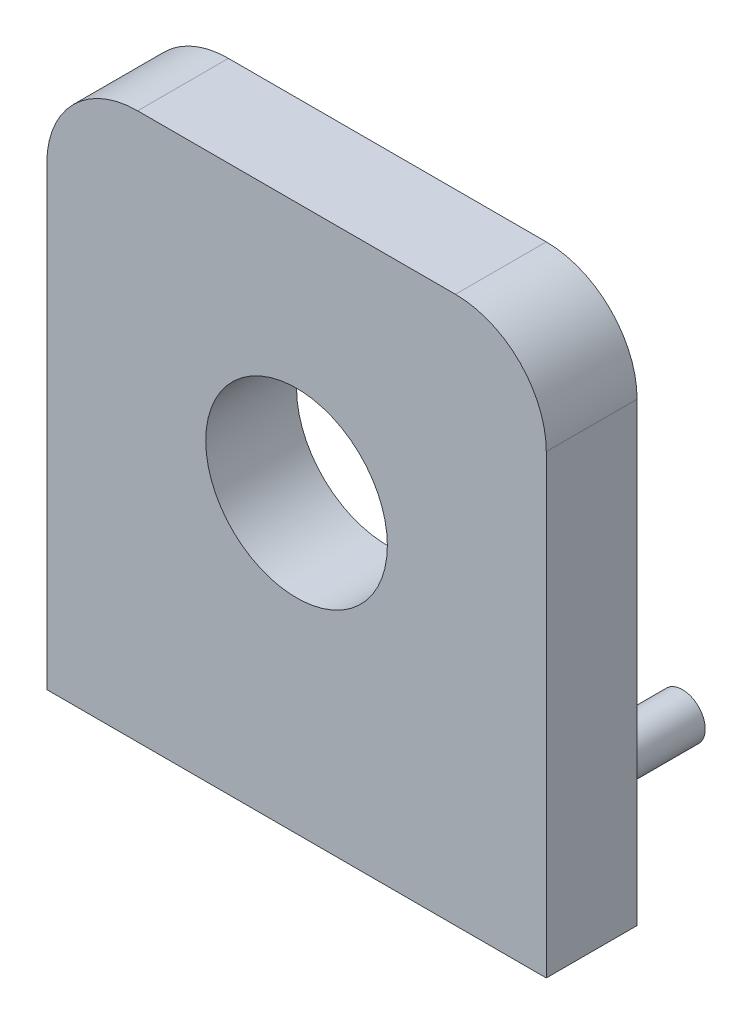
ISO-10303-21;
HEADER;
FILE_DESCRIPTION(('STEP AP214'),'2;1');
FILE_NAME('part.step','',(''),(''),'','','');
FILE_SCHEMA(('AUTOMOTIVE_DESIGN { 1 0 10303 214 1 1 1 1 }'));
ENDSEC;
DATA;
#1=APPLICATION_CONTEXT('core data for automotive mechanical design processes');
#2=APPLICATION_PROTOCOL_DEFINITION('international standard','automotive_design',2000,#1);
#3=PRODUCT_CONTEXT('',#1,'mechanical');
#4=PRODUCT('Part','Part','',(#3));
#5=PRODUCT_RELATED_PRODUCT_CATEGORY('part','',(#4));
#6=PRODUCT_DEFINITION_FORMATION('','',#4);
#7=PRODUCT_DEFINITION_CONTEXT('part definition',#1,'design');
#8=PRODUCT_DEFINITION('design','',#6,#7);
#9=PRODUCT_DEFINITION_SHAPE('','',#8);
#10=(LENGTH_UNIT() NAMED_UNIT(*) SI_UNIT(.MILLI.,.METRE.));
#11=(NAMED_UNIT(*) PLANE_ANGLE_UNIT() SI_UNIT($,.RADIAN.));
#12=(NAMED_UNIT(*) SI_UNIT($,.STERADIAN.) SOLID_ANGLE_UNIT());
#13=UNCERTAINTY_MEASURE_WITH_UNIT(LENGTH_MEASURE(1.E-05),#10,'distance_accuracy_value','');
#14=(GEOMETRIC_REPRESENTATION_CONTEXT(3) GLOBAL_UNCERTAINTY_ASSIGNED_CONTEXT((#13)) GLOBAL_UNIT_ASSIGNED_CONTEXT((#10,
#11,#12)) REPRESENTATION_CONTEXT('',''));
#15=CARTESIAN_POINT('',(0.,0.,0.));
#16=DIRECTION('',(0.,0.,1.));
#17=DIRECTION('',(1.,0.,0.));
#18=AXIS2_PLACEMENT_3D('',#15,#16,#17);
#19=CARTESIAN_POINT('',(5.5,5.54,2.));
#20=DIRECTION('',(-1.,0.,0.));
#21=DIRECTION('',(0.,0.,1.));
#22=AXIS2_PLACEMENT_3D('',#19,#20,#21);
#23=PLANE('',#22);
#24=DIRECTION('',(0.,1.,0.));
#25=VECTOR('',#24,1.);
#26=CARTESIAN_POINT('',(5.5,5.54,0.));
#27=LINE('',#26,#25);
#28=CARTESIAN_POINT('',(5.5,-6.5,0.));
#29=VERTEX_POINT('',#28);
#30=CARTESIAN_POINT('',(5.5,3.54,0.));
#31=VERTEX_POINT('',#30);
#32=EDGE_CURVE('E126',#29,#31,#27,.T.);
#33=ORIENTED_EDGE('',*,*,#32,.T.);
#34=DIRECTION('',(0.,0.,-1.));
#35=VECTOR('',#34,1.);
#36=CARTESIAN_POINT('',(5.5,3.54,2.));
#37=LINE('',#36,#35);
#38=CARTESIAN_POINT('',(5.5,3.54,2.));
#39=VERTEX_POINT('',#38);
#40=EDGE_CURVE('E153',#31,#39,#37,.F.);
#41=ORIENTED_EDGE('',*,*,#40,.T.);
#42=DIRECTION('',(0.,1.,0.));
#43=VECTOR('',#42,1.);
#44=CARTESIAN_POINT('',(5.5,5.54,2.));
#45=LINE('',#44,#43);
#46=CARTESIAN_POINT('',(5.5,-6.5,2.));
#47=VERTEX_POINT('',#46);
#48=EDGE_CURVE('E136',#47,#39,#45,.T.);
#49=ORIENTED_EDGE('',*,*,#48,.F.);
#50=DIRECTION('',(0.,0.,-1.));
#51=VECTOR('',#50,1.);
#52=CARTESIAN_POINT('',(5.5,-6.5,2.));
#53=LINE('',#52,#51);
#54=EDGE_CURVE('E117',#47,#29,#53,.T.);
#55=ORIENTED_EDGE('',*,*,#54,.T.);
#56=EDGE_LOOP('',(#33,#41,#49,#55));
#57=FACE_BOUND('',#56,.T.);
#58=ADVANCED_FACE('F34',(#57),#23,.F.);
#59=CARTESIAN_POINT('',(-5.5,5.54,2.));
#60=DIRECTION('',(0.,-1.,0.));
#61=DIRECTION('',(0.,0.,-1.));
#62=AXIS2_PLACEMENT_3D('',#59,#60,#61);
#63=PLANE('',#62);
#64=DIRECTION('',(-1.,0.,0.));
#65=VECTOR('',#64,1.);
#66=CARTESIAN_POINT('',(-5.5,5.54,0.));
#67=LINE('',#66,#65);
#68=CARTESIAN_POINT('',(3.5,5.54,0.));
#69=VERTEX_POINT('',#68);
#70=CARTESIAN_POINT('',(-3.5,5.54,0.));
#71=VERTEX_POINT('',#70);
#72=EDGE_CURVE('E129',#69,#71,#67,.T.);
#73=ORIENTED_EDGE('',*,*,#72,.T.);
#74=DIRECTION('',(0.,0.,-1.));
#75=VECTOR('',#74,1.);
#76=CARTESIAN_POINT('',(-3.5,5.54,2.));
#77=LINE('',#76,#75);
#78=CARTESIAN_POINT('',(-3.5,5.54,2.));
#79=VERTEX_POINT('',#78);
#80=EDGE_CURVE('E148',#71,#79,#77,.F.);
#81=ORIENTED_EDGE('',*,*,#80,.T.);
#82=DIRECTION('',(-1.,0.,0.));
#83=VECTOR('',#82,1.);
#84=CARTESIAN_POINT('',(-5.5,5.54,2.));
#85=LINE('',#84,#83);
#86=CARTESIAN_POINT('',(3.5,5.54,2.));
#87=VERTEX_POINT('',#86);
#88=EDGE_CURVE('E106',#87,#79,#85,.T.);
#89=ORIENTED_EDGE('',*,*,#88,.F.);
#90=DIRECTION('',(0.,0.,-1.));
#91=VECTOR('',#90,1.);
#92=CARTESIAN_POINT('',(3.5,5.54,2.));
#93=LINE('',#92,#91);
#94=EDGE_CURVE('E145',#87,#69,#93,.T.);
#95=ORIENTED_EDGE('',*,*,#94,.T.);
#96=EDGE_LOOP('',(#73,#81,#89,#95));
#97=FACE_BOUND('',#96,.T.);
#98=ADVANCED_FACE('F240',(#97),#63,.F.);
#99=CARTESIAN_POINT('',(-5.5,-6.5,2.));
#100=DIRECTION('',(1.,0.,0.));
#101=DIRECTION('',(0.,0.,-1.));
#102=AXIS2_PLACEMENT_3D('',#99,#100,#101);
#103=PLANE('',#102);
#104=DIRECTION('',(0.,-1.,0.));
#105=VECTOR('',#104,1.);
#106=CARTESIAN_POINT('',(-5.5,-6.5,2.));
#107=LINE('',#106,#105);
#108=CARTESIAN_POINT('',(-5.5,3.54,2.));
#109=VERTEX_POINT('',#108);
#110=CARTESIAN_POINT('',(-5.5,-6.5,2.));
#111=VERTEX_POINT('',#110);
#112=EDGE_CURVE('E93',#109,#111,#107,.T.);
#113=ORIENTED_EDGE('',*,*,#112,.F.);
#114=DIRECTION('',(0.,0.,-1.));
#115=VECTOR('',#114,1.);
#116=CARTESIAN_POINT('',(-5.5,3.54,2.));
#117=LINE('',#116,#115);
#118=CARTESIAN_POINT('',(-5.5,3.54,0.));
#119=VERTEX_POINT('',#118);
#120=EDGE_CURVE('E116',#109,#119,#117,.T.);
#121=ORIENTED_EDGE('',*,*,#120,.T.);
#122=DIRECTION('',(0.,-1.,0.));
#123=VECTOR('',#122,1.);
#124=CARTESIAN_POINT('',(-5.5,-6.5,0.));
#125=LINE('',#124,#123);
#126=CARTESIAN_POINT('',(-5.5,-6.5,0.));
#127=VERTEX_POINT('',#126);
#128=EDGE_CURVE('E112',#119,#127,#125,.T.);
#129=ORIENTED_EDGE('',*,*,#128,.T.);
#130=DIRECTION('',(0.,0.,-1.));
#131=VECTOR('',#130,1.);
#132=CARTESIAN_POINT('',(-5.5,-6.5,2.));
#133=LINE('',#132,#131);
#134=EDGE_CURVE('E109',#111,#127,#133,.T.);
#135=ORIENTED_EDGE('',*,*,#134,.F.);
#136=EDGE_LOOP('',(#113,#121,#129,#135));
#137=FACE_BOUND('',#136,.T.);
#138=ADVANCED_FACE('F110',(#137),#103,.F.);
#139=CARTESIAN_POINT('',(5.5,-6.5,2.));
#140=DIRECTION('',(0.,1.,0.));
#141=DIRECTION('',(0.,0.,1.));
#142=AXIS2_PLACEMENT_3D('',#139,#140,#141);
#143=PLANE('',#142);
#144=DIRECTION('',(1.,0.,0.));
#145=VECTOR('',#144,1.);
#146=CARTESIAN_POINT('',(5.5,-6.5,0.));
#147=LINE('',#146,#145);
#148=CARTESIAN_POINT('',(-2.5,-6.5,0.));
#149=VERTEX_POINT('',#148);
#150=EDGE_CURVE('E135',#127,#149,#147,.T.);
#151=ORIENTED_EDGE('',*,*,#150,.T.);
#152=CARTESIAN_POINT('',(0.,-6.5,0.));
#153=VERTEX_POINT('',#152);
#154=EDGE_CURVE('E137',#149,#153,#147,.T.);
#155=ORIENTED_EDGE('',*,*,#154,.T.);
#156=CARTESIAN_POINT('',(2.5,-6.5,0.));
#157=VERTEX_POINT('',#156);
#158=EDGE_CURVE('E138',#153,#157,#147,.T.);
#159=ORIENTED_EDGE('',*,*,#158,.T.);
#160=EDGE_CURVE('E134',#157,#29,#147,.T.);
#161=ORIENTED_EDGE('',*,*,#160,.T.);
#162=ORIENTED_EDGE('',*,*,#54,.F.);
#163=DIRECTION('',(1.,0.,0.));
#164=VECTOR('',#163,1.);
#165=CARTESIAN_POINT('',(5.5,-6.5,2.));
#166=LINE('',#165,#164);
#167=EDGE_CURVE('E99',#111,#47,#166,.T.);
#168=ORIENTED_EDGE('',*,*,#167,.F.);
#169=ORIENTED_EDGE('',*,*,#134,.T.);
#170=EDGE_LOOP('',(#151,#155,#159,#161,#162,#168,#169));
#171=FACE_BOUND('',#170,.T.);
#172=ADVANCED_FACE('F119',(#171),#143,.F.);
#173=CARTESIAN_POINT('',(0.,0.,2.));
#174=DIRECTION('',(0.,0.,-1.));
#175=DIRECTION('',(-1.,0.,0.));
#176=AXIS2_PLACEMENT_3D('',#173,#174,#175);
#177=PLANE('',#176);
#178=CARTESIAN_POINT('',(0.,0.,2.));
#179=DIRECTION('',(0.,0.,1.));
#180=DIRECTION('',(1.,0.,0.));
#181=AXIS2_PLACEMENT_3D('',#178,#179,#180);
#182=CIRCLE('',#181,2.);
#183=CARTESIAN_POINT('',(2.,0.,2.));
#184=VERTEX_POINT('',#183);
#185=EDGE_CURVE('E130',#184,#184,#182,.T.);
#186=ORIENTED_EDGE('',*,*,#185,.F.);
#187=EDGE_LOOP('',(#186));
#188=FACE_BOUND('',#187,.T.);
#189=ORIENTED_EDGE('',*,*,#88,.T.);
#190=CARTESIAN_POINT('',(-3.5,3.54,2.));
#191=DIRECTION('',(0.,0.,-1.));
#192=DIRECTION('',(-1.,0.,0.));
#193=AXIS2_PLACEMENT_3D('',#190,#191,#192);
#194=CIRCLE('',#193,2.);
#195=EDGE_CURVE('E102',#79,#109,#194,.F.);
#196=ORIENTED_EDGE('',*,*,#195,.T.);
#197=ORIENTED_EDGE('',*,*,#112,.T.);
#198=ORIENTED_EDGE('',*,*,#167,.T.);
#199=ORIENTED_EDGE('',*,*,#48,.T.);
#200=CARTESIAN_POINT('',(3.5,3.54,2.));
#201=DIRECTION('',(0.,0.,-1.));
#202=DIRECTION('',(-1.,0.,0.));
#203=AXIS2_PLACEMENT_3D('',#200,#201,#202);
#204=CIRCLE('',#203,2.);
#205=EDGE_CURVE('E150',#39,#87,#204,.F.);
#206=ORIENTED_EDGE('',*,*,#205,.T.);
#207=EDGE_LOOP('',(#189,#196,#197,#198,#199,#206));
#208=FACE_BOUND('',#207,.T.);
#209=ADVANCED_FACE('F96',(#188,#208),#177,.F.);
#210=CARTESIAN_POINT('',(0.,0.,0.));
#211=DIRECTION('',(0.,0.,-1.));
#212=DIRECTION('',(-1.,0.,0.));
#213=AXIS2_PLACEMENT_3D('',#210,#211,#212);
#214=PLANE('',#213);
#215=CARTESIAN_POINT('',(-2.5,-4.493,0.));
#216=DIRECTION('',(0.,0.,-1.));
#217=DIRECTION('',(-1.,0.,0.));
#218=AXIS2_PLACEMENT_3D('',#215,#216,#217);
#219=CIRCLE('',#218,0.5);
#220=CARTESIAN_POINT('',(-3.,-4.493,0.));
#221=VERTEX_POINT('',#220);
#222=EDGE_CURVE('E11',#221,#221,#219,.T.);
#223=ORIENTED_EDGE('',*,*,#222,.F.);
#224=EDGE_LOOP('',(#223));
#225=FACE_BOUND('',#224,.T.);
#226=CARTESIAN_POINT('',(2.5,-4.493,0.));
#227=DIRECTION('',(0.,0.,-1.));
#228=DIRECTION('',(-1.,0.,0.));
#229=AXIS2_PLACEMENT_3D('',#226,#227,#228);
#230=CIRCLE('',#229,0.5);
#231=CARTESIAN_POINT('',(2.,-4.493,0.));
#232=VERTEX_POINT('',#231);
#233=EDGE_CURVE('E42',#232,#232,#230,.T.);
#234=ORIENTED_EDGE('',*,*,#233,.F.);
#235=EDGE_LOOP('',(#234));
#236=FACE_BOUND('',#235,.T.);
#237=CARTESIAN_POINT('',(-2.5,3.,0.));
#238=DIRECTION('',(0.,0.,-1.));
#239=DIRECTION('',(-1.,0.,0.));
#240=AXIS2_PLACEMENT_3D('',#237,#238,#239);
#241=CIRCLE('',#240,0.5);
#242=CARTESIAN_POINT('',(-3.,3.,0.));
#243=VERTEX_POINT('',#242);
#244=EDGE_CURVE('E158',#243,#243,#241,.T.);
#245=ORIENTED_EDGE('',*,*,#244,.F.);
#246=EDGE_LOOP('',(#245));
#247=FACE_BOUND('',#246,.T.);
#248=CARTESIAN_POINT('',(2.5,3.,0.));
#249=DIRECTION('',(0.,0.,-1.));
#250=DIRECTION('',(-1.,0.,0.));
#251=AXIS2_PLACEMENT_3D('',#248,#249,#250);
#252=CIRCLE('',#251,0.5);
#253=CARTESIAN_POINT('',(2.,3.,0.));
#254=VERTEX_POINT('',#253);
#255=EDGE_CURVE('E155',#254,#254,#252,.T.);
#256=ORIENTED_EDGE('',*,*,#255,.F.);
#257=EDGE_LOOP('',(#256));
#258=FACE_BOUND('',#257,.T.);
#259=CARTESIAN_POINT('',(0.,0.,0.));
#260=DIRECTION('',(0.,0.,1.));
#261=DIRECTION('',(1.,0.,0.));
#262=AXIS2_PLACEMENT_3D('',#259,#260,#261);
#263=CIRCLE('',#262,2.);
#264=CARTESIAN_POINT('',(2.,0.,0.));
#265=VERTEX_POINT('',#264);
#266=EDGE_CURVE('E178',#265,#265,#263,.T.);
#267=ORIENTED_EDGE('',*,*,#266,.T.);
#268=EDGE_LOOP('',(#267));
#269=FACE_BOUND('',#268,.T.);
#270=ORIENTED_EDGE('',*,*,#160,.F.);
#271=CARTESIAN_POINT('',(2.5,-6.,0.));
#272=DIRECTION('',(0.,0.,-1.));
#273=DIRECTION('',(-1.,0.,0.));
#274=AXIS2_PLACEMENT_3D('',#271,#272,#273);
#275=CIRCLE('',#274,0.5);
#276=EDGE_CURVE('E47',#157,#157,#275,.T.);
#277=ORIENTED_EDGE('',*,*,#276,.F.);
#278=ORIENTED_EDGE('',*,*,#158,.F.);
#279=CARTESIAN_POINT('',(0.,-6.,0.));
#280=DIRECTION('',(0.,0.,-1.));
#281=DIRECTION('',(-1.,0.,0.));
#282=AXIS2_PLACEMENT_3D('',#279,#280,#281);
#283=CIRCLE('',#282,0.5);
#284=EDGE_CURVE('E186',#153,#153,#283,.T.);
#285=ORIENTED_EDGE('',*,*,#284,.F.);
#286=ORIENTED_EDGE('',*,*,#154,.F.);
#287=CARTESIAN_POINT('',(-2.5,-6.,0.));
#288=DIRECTION('',(0.,0.,-1.));
#289=DIRECTION('',(-1.,0.,0.));
#290=AXIS2_PLACEMENT_3D('',#287,#288,#289);
#291=CIRCLE('',#290,0.5);
#292=EDGE_CURVE('E52',#149,#149,#291,.T.);
#293=ORIENTED_EDGE('',*,*,#292,.F.);
#294=ORIENTED_EDGE('',*,*,#150,.F.);
#295=ORIENTED_EDGE('',*,*,#128,.F.);
#296=CARTESIAN_POINT('',(-3.5,3.54,0.));
#297=DIRECTION('',(0.,0.,-1.));
#298=DIRECTION('',(-1.,0.,0.));
#299=AXIS2_PLACEMENT_3D('',#296,#297,#298);
#300=CIRCLE('',#299,2.);
#301=EDGE_CURVE('E143',#119,#71,#300,.T.);
#302=ORIENTED_EDGE('',*,*,#301,.T.);
#303=ORIENTED_EDGE('',*,*,#72,.F.);
#304=CARTESIAN_POINT('',(3.5,3.54,0.));
#305=DIRECTION('',(0.,0.,-1.));
#306=DIRECTION('',(-1.,0.,0.));
#307=AXIS2_PLACEMENT_3D('',#304,#305,#306);
#308=CIRCLE('',#307,2.);
#309=EDGE_CURVE('E141',#69,#31,#308,.T.);
#310=ORIENTED_EDGE('',*,*,#309,.T.);
#311=ORIENTED_EDGE('',*,*,#32,.F.);
#312=EDGE_LOOP('',(#270,#277,#278,#285,#286,#293,#294,#295,#302,#303,#310,#311));
#313=FACE_BOUND('',#312,.T.);
#314=ADVANCED_FACE('F165',(#225,#236,#247,#258,#269,#313),#214,.T.);
#315=CARTESIAN_POINT('',(-3.5,3.54,2.));
#316=DIRECTION('',(0.,0.,-1.));
#317=DIRECTION('',(-1.,0.,0.));
#318=AXIS2_PLACEMENT_3D('',#315,#316,#317);
#319=CYLINDRICAL_SURFACE('',#318,2.);
#320=ORIENTED_EDGE('',*,*,#195,.F.);
#321=ORIENTED_EDGE('',*,*,#80,.F.);
#322=ORIENTED_EDGE('',*,*,#301,.F.);
#323=ORIENTED_EDGE('',*,*,#120,.F.);
#324=EDGE_LOOP('',(#320,#321,#322,#323));
#325=FACE_BOUND('',#324,.T.);
#326=ADVANCED_FACE('F168',(#325),#319,.T.);
#327=CARTESIAN_POINT('',(3.5,3.54,2.));
#328=DIRECTION('',(0.,0.,-1.));
#329=DIRECTION('',(-1.,0.,0.));
#330=AXIS2_PLACEMENT_3D('',#327,#328,#329);
#331=CYLINDRICAL_SURFACE('',#330,2.);
#332=ORIENTED_EDGE('',*,*,#205,.F.);
#333=ORIENTED_EDGE('',*,*,#40,.F.);
#334=ORIENTED_EDGE('',*,*,#309,.F.);
#335=ORIENTED_EDGE('',*,*,#94,.F.);
#336=EDGE_LOOP('',(#332,#333,#334,#335));
#337=FACE_BOUND('',#336,.T.);
#338=ADVANCED_FACE('F36',(#337),#331,.T.);
#339=CARTESIAN_POINT('',(0.,0.,2.));
#340=DIRECTION('',(0.,0.,-1.));
#341=DIRECTION('',(-1.,0.,0.));
#342=AXIS2_PLACEMENT_3D('',#339,#340,#341);
#343=CYLINDRICAL_SURFACE('',#342,2.);
#344=ORIENTED_EDGE('',*,*,#185,.T.);
#345=EDGE_LOOP('',(#344));
#346=FACE_BOUND('',#345,.T.);
#347=ORIENTED_EDGE('',*,*,#266,.F.);
#348=EDGE_LOOP('',(#347));
#349=FACE_BOUND('',#348,.T.);
#350=ADVANCED_FACE('F252',(#346,#349),#343,.F.);
#351=CARTESIAN_POINT('',(2.5,3.,-0.5));
#352=DIRECTION('',(0.,0.,1.));
#353=DIRECTION('',(1.,0.,0.));
#354=AXIS2_PLACEMENT_3D('',#351,#352,#353);
#355=CYLINDRICAL_SURFACE('',#354,0.5);
#356=CARTESIAN_POINT('',(2.5,3.,-0.5));
#357=DIRECTION('',(0.,0.,1.));
#358=DIRECTION('',(1.,0.,0.));
#359=AXIS2_PLACEMENT_3D('',#356,#357,#358);
#360=CIRCLE('',#359,0.5);
#361=CARTESIAN_POINT('',(3.,3.,-0.5));
#362=VERTEX_POINT('',#361);
#363=EDGE_CURVE('E206',#362,#362,#360,.T.);
#364=ORIENTED_EDGE('',*,*,#363,.T.);
#365=EDGE_LOOP('',(#364));
#366=FACE_BOUND('',#365,.T.);
#367=ORIENTED_EDGE('',*,*,#255,.T.);
#368=EDGE_LOOP('',(#367));
#369=FACE_BOUND('',#368,.T.);
#370=ADVANCED_FACE('F257',(#366,#369),#355,.T.);
#371=CARTESIAN_POINT('',(2.5,3.,-0.5));
#372=DIRECTION('',(0.,0.,1.));
#373=DIRECTION('',(1.,0.,0.));
#374=AXIS2_PLACEMENT_3D('',#371,#372,#373);
#375=PLANE('',#374);
#376=ORIENTED_EDGE('',*,*,#363,.F.);
#377=EDGE_LOOP('',(#376));
#378=FACE_BOUND('',#377,.T.);
#379=ADVANCED_FACE('F264',(#378),#375,.F.);
#380=CARTESIAN_POINT('',(-2.5,3.,-0.5));
#381=DIRECTION('',(0.,0.,1.));
#382=DIRECTION('',(1.,0.,0.));
#383=AXIS2_PLACEMENT_3D('',#380,#381,#382);
#384=CYLINDRICAL_SURFACE('',#383,0.5);
#385=CARTESIAN_POINT('',(-2.5,3.,-0.5));
#386=DIRECTION('',(0.,0.,1.));
#387=DIRECTION('',(1.,0.,0.));
#388=AXIS2_PLACEMENT_3D('',#385,#386,#387);
#389=CIRCLE('',#388,0.5);
#390=CARTESIAN_POINT('',(-2.,3.,-0.5));
#391=VERTEX_POINT('',#390);
#392=EDGE_CURVE('E203',#391,#391,#389,.T.);
#393=ORIENTED_EDGE('',*,*,#392,.T.);
#394=EDGE_LOOP('',(#393));
#395=FACE_BOUND('',#394,.T.);
#396=ORIENTED_EDGE('',*,*,#244,.T.);
#397=EDGE_LOOP('',(#396));
#398=FACE_BOUND('',#397,.T.);
#399=ADVANCED_FACE('F363',(#395,#398),#384,.T.);
#400=CARTESIAN_POINT('',(-2.5,3.,-0.5));
#401=DIRECTION('',(0.,0.,1.));
#402=DIRECTION('',(1.,0.,0.));
#403=AXIS2_PLACEMENT_3D('',#400,#401,#402);
#404=PLANE('',#403);
#405=ORIENTED_EDGE('',*,*,#392,.F.);
#406=EDGE_LOOP('',(#405));
#407=FACE_BOUND('',#406,.T.);
#408=ADVANCED_FACE('F359',(#407),#404,.F.);
#409=CARTESIAN_POINT('',(2.5,-4.493,-0.5));
#410=DIRECTION('',(0.,0.,1.));
#411=DIRECTION('',(1.,0.,0.));
#412=AXIS2_PLACEMENT_3D('',#409,#410,#411);
#413=CYLINDRICAL_SURFACE('',#412,0.5);
#414=CARTESIAN_POINT('',(2.5,-4.493,-0.5));
#415=DIRECTION('',(0.,0.,1.));
#416=DIRECTION('',(1.,0.,0.));
#417=AXIS2_PLACEMENT_3D('',#414,#415,#416);
#418=CIRCLE('',#417,0.5);
#419=CARTESIAN_POINT('',(3.,-4.493,-0.5));
#420=VERTEX_POINT('',#419);
#421=EDGE_CURVE('E200',#420,#420,#418,.T.);
#422=ORIENTED_EDGE('',*,*,#421,.T.);
#423=EDGE_LOOP('',(#422));
#424=FACE_BOUND('',#423,.T.);
#425=ORIENTED_EDGE('',*,*,#233,.T.);
#426=EDGE_LOOP('',(#425));
#427=FACE_BOUND('',#426,.T.);
#428=ADVANCED_FACE('F163',(#424,#427),#413,.T.);
#429=CARTESIAN_POINT('',(2.5,-4.493,-0.5));
#430=DIRECTION('',(0.,0.,1.));
#431=DIRECTION('',(1.,0.,0.));
#432=AXIS2_PLACEMENT_3D('',#429,#430,#431);
#433=PLANE('',#432);
#434=ORIENTED_EDGE('',*,*,#421,.F.);
#435=EDGE_LOOP('',(#434));
#436=FACE_BOUND('',#435,.T.);
#437=ADVANCED_FACE('F352',(#436),#433,.F.);
#438=CARTESIAN_POINT('',(-2.5,-4.493,-0.5));
#439=DIRECTION('',(0.,0.,1.));
#440=DIRECTION('',(1.,0.,0.));
#441=AXIS2_PLACEMENT_3D('',#438,#439,#440);
#442=CYLINDRICAL_SURFACE('',#441,0.5);
#443=CARTESIAN_POINT('',(-2.5,-4.493,-0.5));
#444=DIRECTION('',(0.,0.,1.));
#445=DIRECTION('',(1.,0.,0.));
#446=AXIS2_PLACEMENT_3D('',#443,#444,#445);
#447=CIRCLE('',#446,0.5);
#448=CARTESIAN_POINT('',(-2.,-4.493,-0.5));
#449=VERTEX_POINT('',#448);
#450=EDGE_CURVE('E192',#449,#449,#447,.T.);
#451=ORIENTED_EDGE('',*,*,#450,.T.);
#452=EDGE_LOOP('',(#451));
#453=FACE_BOUND('',#452,.T.);
#454=ORIENTED_EDGE('',*,*,#222,.T.);
#455=EDGE_LOOP('',(#454));
#456=FACE_BOUND('',#455,.T.);
#457=ADVANCED_FACE('F348',(#453,#456),#442,.T.);
#458=CARTESIAN_POINT('',(-2.5,-4.493,-0.5));
#459=DIRECTION('',(0.,0.,1.));
#460=DIRECTION('',(1.,0.,0.));
#461=AXIS2_PLACEMENT_3D('',#458,#459,#460);
#462=PLANE('',#461);
#463=ORIENTED_EDGE('',*,*,#450,.F.);
#464=EDGE_LOOP('',(#463));
#465=FACE_BOUND('',#464,.T.);
#466=ADVANCED_FACE('F304',(#465),#462,.F.);
#467=CARTESIAN_POINT('',(0.,-6.,-4.));
#468=DIRECTION('',(0.,0.,1.));
#469=DIRECTION('',(1.,0.,0.));
#470=AXIS2_PLACEMENT_3D('',#467,#468,#469);
#471=CYLINDRICAL_SURFACE('',#470,0.5);
#472=CARTESIAN_POINT('',(0.,-6.,-4.));
#473=DIRECTION('',(0.,0.,-1.));
#474=DIRECTION('',(-1.,0.,0.));
#475=AXIS2_PLACEMENT_3D('',#472,#473,#474);
#476=CIRCLE('',#475,0.5);
#477=CARTESIAN_POINT('',(-0.5,-6.,-4.));
#478=VERTEX_POINT('',#477);
#479=EDGE_CURVE('E188',#478,#478,#476,.T.);
#480=ORIENTED_EDGE('',*,*,#479,.F.);
#481=EDGE_LOOP('',(#480));
#482=FACE_BOUND('',#481,.T.);
#483=ORIENTED_EDGE('',*,*,#284,.T.);
#484=EDGE_LOOP('',(#483));
#485=FACE_BOUND('',#484,.T.);
#486=ADVANCED_FACE('F298',(#482,#485),#471,.T.);
#487=CARTESIAN_POINT('',(0.,-6.,-4.));
#488=DIRECTION('',(0.,0.,-1.));
#489=DIRECTION('',(-1.,0.,0.));
#490=AXIS2_PLACEMENT_3D('',#487,#488,#489);
#491=PLANE('',#490);
#492=ORIENTED_EDGE('',*,*,#479,.T.);
#493=EDGE_LOOP('',(#492));
#494=FACE_BOUND('',#493,.T.);
#495=ADVANCED_FACE('F303',(#494),#491,.T.);
#496=CARTESIAN_POINT('',(-2.5,-6.,-4.));
#497=DIRECTION('',(0.,0.,1.));
#498=DIRECTION('',(1.,0.,0.));
#499=AXIS2_PLACEMENT_3D('',#496,#497,#498);
#500=CYLINDRICAL_SURFACE('',#499,0.5);
#501=CARTESIAN_POINT('',(-2.5,-6.,-4.));
#502=DIRECTION('',(0.,0.,-1.));
#503=DIRECTION('',(-1.,0.,0.));
#504=AXIS2_PLACEMENT_3D('',#501,#502,#503);
#505=CIRCLE('',#504,0.5);
#506=CARTESIAN_POINT('',(-3.,-6.,-4.));
#507=VERTEX_POINT('',#506);
#508=EDGE_CURVE('E189',#507,#507,#505,.T.);
#509=ORIENTED_EDGE('',*,*,#508,.F.);
#510=EDGE_LOOP('',(#509));
#511=FACE_BOUND('',#510,.T.);
#512=ORIENTED_EDGE('',*,*,#292,.T.);
#513=EDGE_LOOP('',(#512));
#514=FACE_BOUND('',#513,.T.);
#515=ADVANCED_FACE('F236',(#511,#514),#500,.T.);
#516=CARTESIAN_POINT('',(-2.5,-6.,-4.));
#517=DIRECTION('',(0.,0.,-1.));
#518=DIRECTION('',(-1.,0.,0.));
#519=AXIS2_PLACEMENT_3D('',#516,#517,#518);
#520=PLANE('',#519);
#521=ORIENTED_EDGE('',*,*,#508,.T.);
#522=EDGE_LOOP('',(#521));
#523=FACE_BOUND('',#522,.T.);
#524=ADVANCED_FACE('F229',(#523),#520,.T.);
#525=CARTESIAN_POINT('',(2.5,-6.,-4.));
#526=DIRECTION('',(0.,0.,1.));
#527=DIRECTION('',(1.,0.,0.));
#528=AXIS2_PLACEMENT_3D('',#525,#526,#527);
#529=CYLINDRICAL_SURFACE('',#528,0.5);
#530=CARTESIAN_POINT('',(2.5,-6.,-4.));
#531=DIRECTION('',(0.,0.,-1.));
#532=DIRECTION('',(-1.,0.,0.));
#533=AXIS2_PLACEMENT_3D('',#530,#531,#532);
#534=CIRCLE('',#533,0.5);
#535=CARTESIAN_POINT('',(2.,-6.,-4.));
#536=VERTEX_POINT('',#535);
#537=EDGE_CURVE('E219',#536,#536,#534,.T.);
#538=ORIENTED_EDGE('',*,*,#537,.F.);
#539=EDGE_LOOP('',(#538));
#540=FACE_BOUND('',#539,.T.);
#541=ORIENTED_EDGE('',*,*,#276,.T.);
#542=EDGE_LOOP('',(#541));
#543=FACE_BOUND('',#542,.T.);
#544=ADVANCED_FACE('F227',(#540,#543),#529,.T.);
#545=CARTESIAN_POINT('',(2.5,-6.,-4.));
#546=DIRECTION('',(0.,0.,-1.));
#547=DIRECTION('',(-1.,0.,0.));
#548=AXIS2_PLACEMENT_3D('',#545,#546,#547);
#549=PLANE('',#548);
#550=ORIENTED_EDGE('',*,*,#537,.T.);
#551=EDGE_LOOP('',(#550));
#552=FACE_BOUND('',#551,.T.);
#553=ADVANCED_FACE('F225',(#552),#549,.T.);
#554=CLOSED_SHELL('',(#58,#98,#138,#172,#209,#314,#326,#338,#350,#370,#379,#399,#408,#428,#437,
#457,#466,#486,#495,#515,#524,#544,#553));
#555=MANIFOLD_SOLID_BREP('B2',#554);
#556=ADVANCED_BREP_SHAPE_REPRESENTATION('',(#18,#555),#14);
#557=SHAPE_DEFINITION_REPRESENTATION(#9,#556);
ENDSEC;
END-ISO-10303-21;
